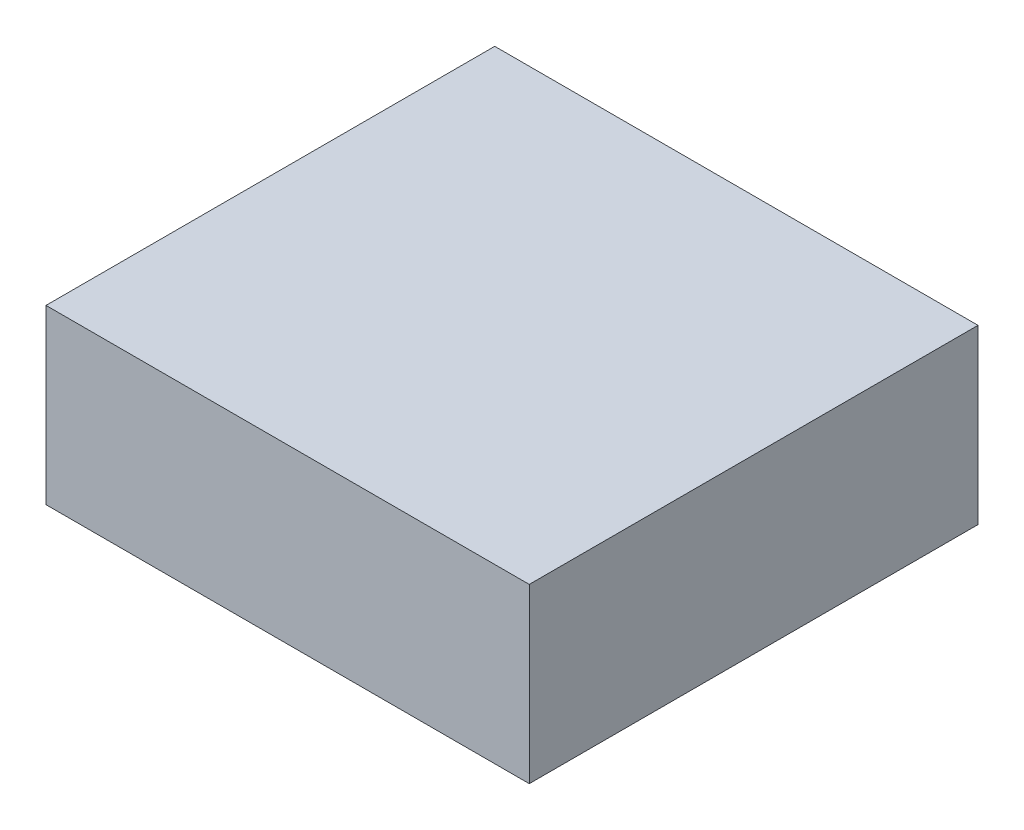
ISO-10303-21;
HEADER;
FILE_DESCRIPTION(('STEP AP214'),'2;1');
FILE_NAME('part.step','',(''),(''),'','','');
FILE_SCHEMA(('AUTOMOTIVE_DESIGN { 1 0 10303 214 1 1 1 1 }'));
ENDSEC;
DATA;
#1=APPLICATION_CONTEXT('core data for automotive mechanical design processes');
#2=APPLICATION_PROTOCOL_DEFINITION('international standard','automotive_design',2000,#1);
#3=PRODUCT_CONTEXT('',#1,'mechanical');
#4=PRODUCT('Part','Part','',(#3));
#5=PRODUCT_RELATED_PRODUCT_CATEGORY('part','',(#4));
#6=PRODUCT_DEFINITION_FORMATION('','',#4);
#7=PRODUCT_DEFINITION_CONTEXT('part definition',#1,'design');
#8=PRODUCT_DEFINITION('design','',#6,#7);
#9=PRODUCT_DEFINITION_SHAPE('','',#8);
#10=(LENGTH_UNIT() NAMED_UNIT(*) SI_UNIT(.MILLI.,.METRE.));
#11=(NAMED_UNIT(*) PLANE_ANGLE_UNIT() SI_UNIT($,.RADIAN.));
#12=(NAMED_UNIT(*) SI_UNIT($,.STERADIAN.) SOLID_ANGLE_UNIT());
#13=UNCERTAINTY_MEASURE_WITH_UNIT(LENGTH_MEASURE(1.E-05),#10,'distance_accuracy_value','');
#14=(GEOMETRIC_REPRESENTATION_CONTEXT(3) GLOBAL_UNCERTAINTY_ASSIGNED_CONTEXT((#13)) GLOBAL_UNIT_ASSIGNED_CONTEXT((#10,
#11,#12)) REPRESENTATION_CONTEXT('',''));
#15=CARTESIAN_POINT('',(0.,0.,0.));
#16=DIRECTION('',(0.,0.,1.));
#17=DIRECTION('',(1.,0.,0.));
#18=AXIS2_PLACEMENT_3D('',#15,#16,#17);
#19=CARTESIAN_POINT('',(-35.,25.,32.5));
#20=DIRECTION('',(1.,0.,0.));
#21=DIRECTION('',(0.,0.,-1.));
#22=AXIS2_PLACEMENT_3D('',#19,#20,#21);
#23=PLANE('',#22);
#24=DIRECTION('',(0.,0.,1.));
#25=VECTOR('',#24,1.);
#26=CARTESIAN_POINT('',(-35.,0.,32.5));
#27=LINE('',#26,#25);
#28=CARTESIAN_POINT('',(-35.,0.,-32.5));
#29=VERTEX_POINT('',#28);
#30=CARTESIAN_POINT('',(-35.,0.,32.5));
#31=VERTEX_POINT('',#30);
#32=EDGE_CURVE('E109',#29,#31,#27,.T.);
#33=ORIENTED_EDGE('',*,*,#32,.T.);
#34=DIRECTION('',(0.,-1.,0.));
#35=VECTOR('',#34,1.);
#36=CARTESIAN_POINT('',(-35.,25.,32.5));
#37=LINE('',#36,#35);
#38=CARTESIAN_POINT('',(-35.,25.,32.5));
#39=VERTEX_POINT('',#38);
#40=EDGE_CURVE('E11',#39,#31,#37,.T.);
#41=ORIENTED_EDGE('',*,*,#40,.F.);
#42=DIRECTION('',(0.,0.,1.));
#43=VECTOR('',#42,1.);
#44=CARTESIAN_POINT('',(-35.,25.,32.5));
#45=LINE('',#44,#43);
#46=CARTESIAN_POINT('',(-35.,25.,-32.5));
#47=VERTEX_POINT('',#46);
#48=EDGE_CURVE('E93',#47,#39,#45,.T.);
#49=ORIENTED_EDGE('',*,*,#48,.F.);
#50=DIRECTION('',(0.,-1.,0.));
#51=VECTOR('',#50,1.);
#52=CARTESIAN_POINT('',(-35.,25.,-32.5));
#53=LINE('',#52,#51);
#54=EDGE_CURVE('E105',#47,#29,#53,.T.);
#55=ORIENTED_EDGE('',*,*,#54,.T.);
#56=EDGE_LOOP('',(#33,#41,#49,#55));
#57=FACE_BOUND('',#56,.T.);
#58=ADVANCED_FACE('F41',(#57),#23,.F.);
#59=CARTESIAN_POINT('',(35.,25.,32.5));
#60=DIRECTION('',(0.,0.,-1.));
#61=DIRECTION('',(-1.,0.,0.));
#62=AXIS2_PLACEMENT_3D('',#59,#60,#61);
#63=PLANE('',#62);
#64=DIRECTION('',(1.,0.,0.));
#65=VECTOR('',#64,1.);
#66=CARTESIAN_POINT('',(35.,0.,32.5));
#67=LINE('',#66,#65);
#68=CARTESIAN_POINT('',(35.,0.,32.5));
#69=VERTEX_POINT('',#68);
#70=EDGE_CURVE('E98',#31,#69,#67,.T.);
#71=ORIENTED_EDGE('',*,*,#70,.T.);
#72=DIRECTION('',(0.,-1.,0.));
#73=VECTOR('',#72,1.);
#74=CARTESIAN_POINT('',(35.,25.,32.5));
#75=LINE('',#74,#73);
#76=CARTESIAN_POINT('',(35.,25.,32.5));
#77=VERTEX_POINT('',#76);
#78=EDGE_CURVE('E50',#77,#69,#75,.T.);
#79=ORIENTED_EDGE('',*,*,#78,.F.);
#80=DIRECTION('',(1.,0.,0.));
#81=VECTOR('',#80,1.);
#82=CARTESIAN_POINT('',(35.,25.,32.5));
#83=LINE('',#82,#81);
#84=EDGE_CURVE('E88',#39,#77,#83,.T.);
#85=ORIENTED_EDGE('',*,*,#84,.F.);
#86=ORIENTED_EDGE('',*,*,#40,.T.);
#87=EDGE_LOOP('',(#71,#79,#85,#86));
#88=FACE_BOUND('',#87,.T.);
#89=ADVANCED_FACE('F97',(#88),#63,.F.);
#90=CARTESIAN_POINT('',(35.,25.,32.5));
#91=DIRECTION('',(-1.,0.,0.));
#92=DIRECTION('',(0.,0.,1.));
#93=AXIS2_PLACEMENT_3D('',#90,#91,#92);
#94=PLANE('',#93);
#95=DIRECTION('',(0.,0.,-1.));
#96=VECTOR('',#95,1.);
#97=CARTESIAN_POINT('',(35.,0.,32.5));
#98=LINE('',#97,#96);
#99=CARTESIAN_POINT('',(35.,0.,-32.5));
#100=VERTEX_POINT('',#99);
#101=EDGE_CURVE('E75',#69,#100,#98,.T.);
#102=ORIENTED_EDGE('',*,*,#101,.T.);
#103=DIRECTION('',(0.,-1.,0.));
#104=VECTOR('',#103,1.);
#105=CARTESIAN_POINT('',(35.,25.,-32.5));
#106=LINE('',#105,#104);
#107=CARTESIAN_POINT('',(35.,25.,-32.5));
#108=VERTEX_POINT('',#107);
#109=EDGE_CURVE('E100',#108,#100,#106,.T.);
#110=ORIENTED_EDGE('',*,*,#109,.F.);
#111=DIRECTION('',(0.,0.,-1.));
#112=VECTOR('',#111,1.);
#113=CARTESIAN_POINT('',(35.,25.,32.5));
#114=LINE('',#113,#112);
#115=EDGE_CURVE('E91',#77,#108,#114,.T.);
#116=ORIENTED_EDGE('',*,*,#115,.F.);
#117=ORIENTED_EDGE('',*,*,#78,.T.);
#118=EDGE_LOOP('',(#102,#110,#116,#117));
#119=FACE_BOUND('',#118,.T.);
#120=ADVANCED_FACE('F101',(#119),#94,.F.);
#121=CARTESIAN_POINT('',(35.,25.,-32.5));
#122=DIRECTION('',(0.,0.,1.));
#123=DIRECTION('',(1.,0.,0.));
#124=AXIS2_PLACEMENT_3D('',#121,#122,#123);
#125=PLANE('',#124);
#126=DIRECTION('',(-1.,0.,0.));
#127=VECTOR('',#126,1.);
#128=CARTESIAN_POINT('',(35.,0.,-32.5));
#129=LINE('',#128,#127);
#130=EDGE_CURVE('E81',#100,#29,#129,.T.);
#131=ORIENTED_EDGE('',*,*,#130,.T.);
#132=ORIENTED_EDGE('',*,*,#54,.F.);
#133=DIRECTION('',(-1.,0.,0.));
#134=VECTOR('',#133,1.);
#135=CARTESIAN_POINT('',(35.,25.,-32.5));
#136=LINE('',#135,#134);
#137=EDGE_CURVE('E58',#108,#47,#136,.T.);
#138=ORIENTED_EDGE('',*,*,#137,.F.);
#139=ORIENTED_EDGE('',*,*,#109,.T.);
#140=EDGE_LOOP('',(#131,#132,#138,#139));
#141=FACE_BOUND('',#140,.T.);
#142=ADVANCED_FACE('F122',(#141),#125,.F.);
#143=CARTESIAN_POINT('',(0.,25.,0.));
#144=DIRECTION('',(0.,1.,0.));
#145=DIRECTION('',(0.,0.,1.));
#146=AXIS2_PLACEMENT_3D('',#143,#144,#145);
#147=PLANE('',#146);
#148=ORIENTED_EDGE('',*,*,#48,.T.);
#149=ORIENTED_EDGE('',*,*,#84,.T.);
#150=ORIENTED_EDGE('',*,*,#115,.T.);
#151=ORIENTED_EDGE('',*,*,#137,.T.);
#152=EDGE_LOOP('',(#148,#149,#150,#151));
#153=FACE_BOUND('',#152,.T.);
#154=ADVANCED_FACE('F89',(#153),#147,.T.);
#155=CARTESIAN_POINT('',(0.,0.,0.));
#156=DIRECTION('',(0.,1.,0.));
#157=DIRECTION('',(0.,0.,1.));
#158=AXIS2_PLACEMENT_3D('',#155,#156,#157);
#159=PLANE('',#158);
#160=ORIENTED_EDGE('',*,*,#32,.F.);
#161=ORIENTED_EDGE('',*,*,#130,.F.);
#162=ORIENTED_EDGE('',*,*,#101,.F.);
#163=ORIENTED_EDGE('',*,*,#70,.F.);
#164=EDGE_LOOP('',(#160,#161,#162,#163));
#165=FACE_BOUND('',#164,.T.);
#166=ADVANCED_FACE('F125',(#165),#159,.F.);
#167=CLOSED_SHELL('',(#58,#89,#120,#142,#154,#166));
#168=MANIFOLD_SOLID_BREP('B2',#167);
#169=ADVANCED_BREP_SHAPE_REPRESENTATION('',(#18,#168),#14);
#170=SHAPE_DEFINITION_REPRESENTATION(#9,#169);
ENDSEC;
END-ISO-10303-21;
